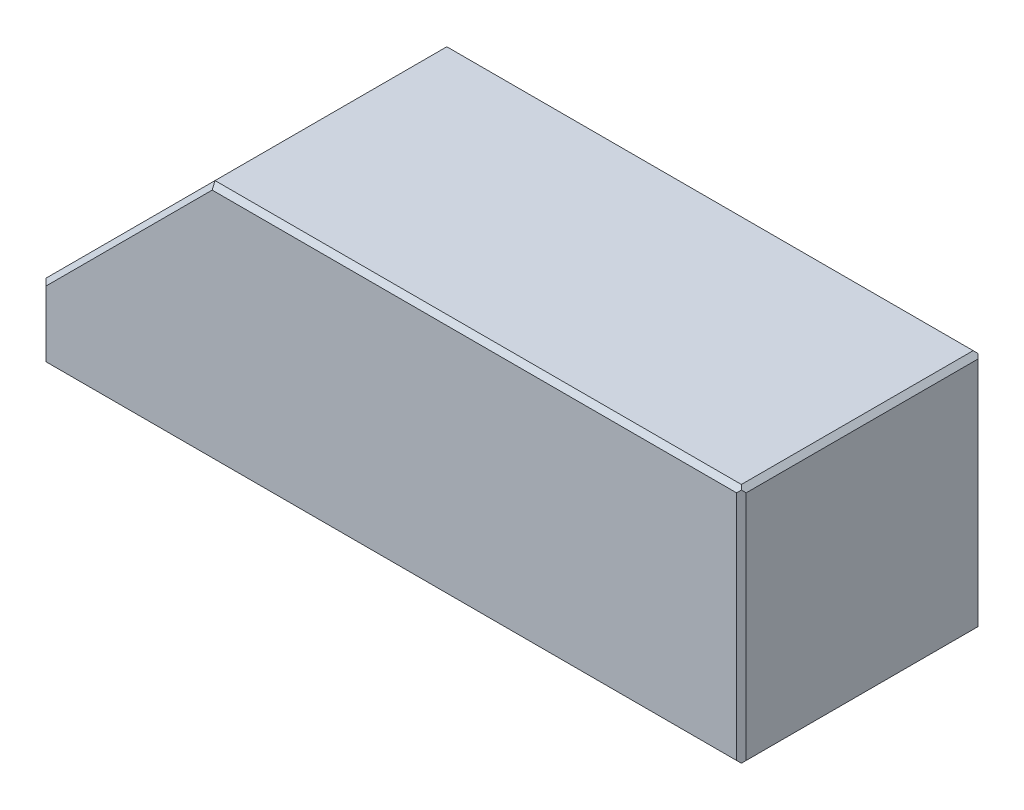
ISO-10303-21;
HEADER;
FILE_DESCRIPTION(('STEP AP214'),'2;1');
FILE_NAME('part.step','',(''),(''),'','','');
FILE_SCHEMA(('AUTOMOTIVE_DESIGN { 1 0 10303 214 1 1 1 1 }'));
ENDSEC;
DATA;
#1=APPLICATION_CONTEXT('core data for automotive mechanical design processes');
#2=APPLICATION_PROTOCOL_DEFINITION('international standard','automotive_design',2000,#1);
#3=PRODUCT_CONTEXT('',#1,'mechanical');
#4=PRODUCT('Part','Part','',(#3));
#5=PRODUCT_RELATED_PRODUCT_CATEGORY('part','',(#4));
#6=PRODUCT_DEFINITION_FORMATION('','',#4);
#7=PRODUCT_DEFINITION_CONTEXT('part definition',#1,'design');
#8=PRODUCT_DEFINITION('design','',#6,#7);
#9=PRODUCT_DEFINITION_SHAPE('','',#8);
#10=(LENGTH_UNIT() NAMED_UNIT(*) SI_UNIT(.MILLI.,.METRE.));
#11=(NAMED_UNIT(*) PLANE_ANGLE_UNIT() SI_UNIT($,.RADIAN.));
#12=(NAMED_UNIT(*) SI_UNIT($,.STERADIAN.) SOLID_ANGLE_UNIT());
#13=UNCERTAINTY_MEASURE_WITH_UNIT(LENGTH_MEASURE(1.E-05),#10,'distance_accuracy_value','');
#14=(GEOMETRIC_REPRESENTATION_CONTEXT(3) GLOBAL_UNCERTAINTY_ASSIGNED_CONTEXT((#13)) GLOBAL_UNIT_ASSIGNED_CONTEXT((#10,
#11,#12)) REPRESENTATION_CONTEXT('',''));
#15=CARTESIAN_POINT('',(0.,0.,0.));
#16=DIRECTION('',(0.,0.,1.));
#17=DIRECTION('',(1.,0.,0.));
#18=AXIS2_PLACEMENT_3D('',#15,#16,#17);
#19=CARTESIAN_POINT('',(-54.5,-5.00000000000001,0.));
#20=DIRECTION('',(1.,0.,0.));
#21=DIRECTION('',(0.,0.,-1.));
#22=AXIS2_PLACEMENT_3D('',#19,#20,#21);
#23=PLANE('',#22);
#24=CARTESIAN_POINT('',(-54.5,-5.,0.));
#25=DIRECTION('',(-1.,0.,0.));
#26=DIRECTION('',(0.,0.,1.));
#27=AXIS2_PLACEMENT_3D('',#24,#25,#26);
#28=CIRCLE('',#27,6.);
#29=CARTESIAN_POINT('',(-54.5,-5.,6.));
#30=VERTEX_POINT('',#29);
#31=EDGE_CURVE('E186',#30,#30,#28,.T.);
#32=ORIENTED_EDGE('',*,*,#31,.T.);
#33=EDGE_LOOP('',(#32));
#34=FACE_BOUND('',#33,.T.);
#35=CARTESIAN_POINT('',(-54.5,-5.,0.));
#36=DIRECTION('',(-1.,0.,0.));
#37=DIRECTION('',(0.,0.,1.));
#38=AXIS2_PLACEMENT_3D('',#35,#36,#37);
#39=CIRCLE('',#38,4.25);
#40=CARTESIAN_POINT('',(-54.5,-5.,4.25));
#41=VERTEX_POINT('',#40);
#42=EDGE_CURVE('E184',#41,#41,#39,.T.);
#43=ORIENTED_EDGE('',*,*,#42,.F.);
#44=EDGE_LOOP('',(#43));
#45=FACE_BOUND('',#44,.T.);
#46=ADVANCED_FACE('F52',(#34,#45),#23,.F.);
#47=CARTESIAN_POINT('',(72.5,-25.,25.));
#48=DIRECTION('',(-1.,0.,0.));
#49=DIRECTION('',(0.,0.,1.));
#50=AXIS2_PLACEMENT_3D('',#47,#48,#49);
#51=PLANE('',#50);
#52=DIRECTION('',(0.,-1.,0.));
#53=VECTOR('',#52,1.);
#54=CARTESIAN_POINT('',(72.5,-25.,24.));
#55=LINE('',#54,#53);
#56=CARTESIAN_POINT('',(72.5,24.,24.));
#57=VERTEX_POINT('',#56);
#58=CARTESIAN_POINT('',(72.5,-24.,24.));
#59=VERTEX_POINT('',#58);
#60=EDGE_CURVE('E223',#57,#59,#55,.T.);
#61=ORIENTED_EDGE('',*,*,#60,.T.);
#62=DIRECTION('',(0.,0.,-1.));
#63=VECTOR('',#62,1.);
#64=CARTESIAN_POINT('',(72.5,-24.,25.));
#65=LINE('',#64,#63);
#66=CARTESIAN_POINT('',(72.5,-24.,-24.));
#67=VERTEX_POINT('',#66);
#68=EDGE_CURVE('E277',#59,#67,#65,.T.);
#69=ORIENTED_EDGE('',*,*,#68,.T.);
#70=DIRECTION('',(0.,1.,0.));
#71=VECTOR('',#70,1.);
#72=CARTESIAN_POINT('',(72.5,25.,-24.));
#73=LINE('',#72,#71);
#74=CARTESIAN_POINT('',(72.5,24.,-24.));
#75=VERTEX_POINT('',#74);
#76=EDGE_CURVE('E226',#67,#75,#73,.T.);
#77=ORIENTED_EDGE('',*,*,#76,.T.);
#78=DIRECTION('',(0.,0.,1.));
#79=VECTOR('',#78,1.);
#80=CARTESIAN_POINT('',(72.5,24.,25.));
#81=LINE('',#80,#79);
#82=EDGE_CURVE('E249',#75,#57,#81,.T.);
#83=ORIENTED_EDGE('',*,*,#82,.T.);
#84=EDGE_LOOP('',(#61,#69,#77,#83));
#85=FACE_BOUND('',#84,.T.);
#86=ADVANCED_FACE('F364',(#85),#51,.F.);
#87=CARTESIAN_POINT('',(-72.5,25.,25.));
#88=DIRECTION('',(0.,-1.,0.));
#89=DIRECTION('',(0.,0.,-1.));
#90=AXIS2_PLACEMENT_3D('',#87,#88,#89);
#91=PLANE('',#90);
#92=DIRECTION('',(1.,0.,0.));
#93=VECTOR('',#92,1.);
#94=CARTESIAN_POINT('',(-72.5,25.,24.));
#95=LINE('',#94,#93);
#96=CARTESIAN_POINT('',(-37.5,25.,24.));
#97=VERTEX_POINT('',#96);
#98=CARTESIAN_POINT('',(71.5,25.,24.));
#99=VERTEX_POINT('',#98);
#100=EDGE_CURVE('E229',#97,#99,#95,.T.);
#101=ORIENTED_EDGE('',*,*,#100,.T.);
#102=DIRECTION('',(0.,0.,-1.));
#103=VECTOR('',#102,1.);
#104=CARTESIAN_POINT('',(71.5,25.,25.));
#105=LINE('',#104,#103);
#106=CARTESIAN_POINT('',(71.5,25.,-24.));
#107=VERTEX_POINT('',#106);
#108=EDGE_CURVE('E295',#99,#107,#105,.T.);
#109=ORIENTED_EDGE('',*,*,#108,.T.);
#110=DIRECTION('',(-1.,0.,0.));
#111=VECTOR('',#110,1.);
#112=CARTESIAN_POINT('',(-37.5,25.,-24.));
#113=LINE('',#112,#111);
#114=CARTESIAN_POINT('',(-37.5,25.,-24.));
#115=VERTEX_POINT('',#114);
#116=EDGE_CURVE('E232',#107,#115,#113,.T.);
#117=ORIENTED_EDGE('',*,*,#116,.T.);
#118=DIRECTION('',(0.,0.,1.));
#119=VECTOR('',#118,1.);
#120=CARTESIAN_POINT('',(-37.5,25.,-25.));
#121=LINE('',#120,#119);
#122=EDGE_CURVE('E195',#115,#97,#121,.T.);
#123=ORIENTED_EDGE('',*,*,#122,.T.);
#124=EDGE_LOOP('',(#101,#109,#117,#123));
#125=FACE_BOUND('',#124,.T.);
#126=ADVANCED_FACE('F371',(#125),#91,.F.);
#127=CARTESIAN_POINT('',(-72.5,-25.,25.));
#128=DIRECTION('',(1.,0.,0.));
#129=DIRECTION('',(0.,0.,-1.));
#130=AXIS2_PLACEMENT_3D('',#127,#128,#129);
#131=PLANE('',#130);
#132=DIRECTION('',(0.,-1.,0.));
#133=VECTOR('',#132,1.);
#134=CARTESIAN_POINT('',(-72.5,-25.,-24.));
#135=LINE('',#134,#133);
#136=CARTESIAN_POINT('',(-72.5,-10.0000000000004,-24.));
#137=VERTEX_POINT('',#136);
#138=CARTESIAN_POINT('',(-72.5,-24.,-24.));
#139=VERTEX_POINT('',#138);
#140=EDGE_CURVE('E205',#137,#139,#135,.T.);
#141=ORIENTED_EDGE('',*,*,#140,.T.);
#142=DIRECTION('',(0.,0.,1.));
#143=VECTOR('',#142,1.);
#144=CARTESIAN_POINT('',(-72.5,-24.,25.));
#145=LINE('',#144,#143);
#146=CARTESIAN_POINT('',(-72.5,-24.,24.));
#147=VERTEX_POINT('',#146);
#148=EDGE_CURVE('E75',#139,#147,#145,.T.);
#149=ORIENTED_EDGE('',*,*,#148,.T.);
#150=DIRECTION('',(0.,1.,0.));
#151=VECTOR('',#150,1.);
#152=CARTESIAN_POINT('',(-72.5,-25.,24.));
#153=LINE('',#152,#151);
#154=CARTESIAN_POINT('',(-72.5,-10.0000000000004,24.));
#155=VERTEX_POINT('',#154);
#156=EDGE_CURVE('E203',#147,#155,#153,.T.);
#157=ORIENTED_EDGE('',*,*,#156,.T.);
#158=DIRECTION('',(0.,0.,1.));
#159=VECTOR('',#158,1.);
#160=CARTESIAN_POINT('',(-72.5,-10.0000000000004,-25.));
#161=LINE('',#160,#159);
#162=CARTESIAN_POINT('',(-72.5,-10.0000000000004,3.31662479035482));
#163=VERTEX_POINT('',#162);
#164=EDGE_CURVE('E194',#163,#155,#161,.T.);
#165=ORIENTED_EDGE('',*,*,#164,.F.);
#166=CARTESIAN_POINT('',(-72.5,-5.,0.));
#167=DIRECTION('',(-1.,0.,0.));
#168=DIRECTION('',(0.,0.,1.));
#169=AXIS2_PLACEMENT_3D('',#166,#167,#168);
#170=CIRCLE('',#169,6.);
#171=CARTESIAN_POINT('',(-72.5,-10.0000000000004,-3.31662479035482));
#172=VERTEX_POINT('',#171);
#173=EDGE_CURVE('E183',#172,#163,#170,.T.);
#174=ORIENTED_EDGE('',*,*,#173,.F.);
#175=EDGE_CURVE('E199',#137,#172,#161,.T.);
#176=ORIENTED_EDGE('',*,*,#175,.F.);
#177=EDGE_LOOP('',(#141,#149,#157,#165,#174,#176));
#178=FACE_BOUND('',#177,.T.);
#179=ADVANCED_FACE('F317',(#178),#131,.F.);
#180=CARTESIAN_POINT('',(-72.5,-25.,25.));
#181=DIRECTION('',(0.,1.,0.));
#182=DIRECTION('',(0.,0.,1.));
#183=AXIS2_PLACEMENT_3D('',#180,#181,#182);
#184=PLANE('',#183);
#185=DIRECTION('',(-1.,0.,0.));
#186=VECTOR('',#185,1.);
#187=CARTESIAN_POINT('',(-72.5,-25.,24.));
#188=LINE('',#187,#186);
#189=CARTESIAN_POINT('',(71.5,-25.,24.));
#190=VERTEX_POINT('',#189);
#191=CARTESIAN_POINT('',(-71.5,-25.,24.));
#192=VERTEX_POINT('',#191);
#193=EDGE_CURVE('E218',#190,#192,#188,.T.);
#194=ORIENTED_EDGE('',*,*,#193,.T.);
#195=DIRECTION('',(0.,0.,-1.));
#196=VECTOR('',#195,1.);
#197=CARTESIAN_POINT('',(-71.5,-25.,25.));
#198=LINE('',#197,#196);
#199=CARTESIAN_POINT('',(-71.5,-25.,-24.));
#200=VERTEX_POINT('',#199);
#201=EDGE_CURVE('E302',#192,#200,#198,.T.);
#202=ORIENTED_EDGE('',*,*,#201,.T.);
#203=DIRECTION('',(1.,0.,0.));
#204=VECTOR('',#203,1.);
#205=CARTESIAN_POINT('',(72.5,-25.,-24.));
#206=LINE('',#205,#204);
#207=CARTESIAN_POINT('',(71.5,-25.,-24.));
#208=VERTEX_POINT('',#207);
#209=EDGE_CURVE('E221',#200,#208,#206,.T.);
#210=ORIENTED_EDGE('',*,*,#209,.T.);
#211=DIRECTION('',(0.,0.,1.));
#212=VECTOR('',#211,1.);
#213=CARTESIAN_POINT('',(71.5,-25.,25.));
#214=LINE('',#213,#212);
#215=EDGE_CURVE('E287',#208,#190,#214,.T.);
#216=ORIENTED_EDGE('',*,*,#215,.T.);
#217=EDGE_LOOP('',(#194,#202,#210,#216));
#218=FACE_BOUND('',#217,.T.);
#219=ADVANCED_FACE('F328',(#218),#184,.F.);
#220=CARTESIAN_POINT('',(0.,0.,25.));
#221=DIRECTION('',(0.,0.,-1.));
#222=DIRECTION('',(-1.,0.,0.));
#223=AXIS2_PLACEMENT_3D('',#220,#221,#222);
#224=PLANE('',#223);
#225=DIRECTION('',(1.,0.,0.));
#226=VECTOR('',#225,1.);
#227=CARTESIAN_POINT('',(0.,-24.,25.));
#228=LINE('',#227,#226);
#229=CARTESIAN_POINT('',(-71.5000000000001,-24.,25.));
#230=VERTEX_POINT('',#229);
#231=CARTESIAN_POINT('',(71.5,-24.,25.));
#232=VERTEX_POINT('',#231);
#233=EDGE_CURVE('E244',#230,#232,#228,.T.);
#234=ORIENTED_EDGE('',*,*,#233,.T.);
#235=DIRECTION('',(0.,1.,0.));
#236=VECTOR('',#235,1.);
#237=CARTESIAN_POINT('',(71.5,0.,25.));
#238=LINE('',#237,#236);
#239=CARTESIAN_POINT('',(71.5,24.,25.));
#240=VERTEX_POINT('',#239);
#241=EDGE_CURVE('E246',#232,#240,#238,.T.);
#242=ORIENTED_EDGE('',*,*,#241,.T.);
#243=DIRECTION('',(-1.,0.,0.));
#244=VECTOR('',#243,1.);
#245=CARTESIAN_POINT('',(0.,24.,25.));
#246=LINE('',#245,#244);
#247=CARTESIAN_POINT('',(-37.085786437627,24.,25.));
#248=VERTEX_POINT('',#247);
#249=EDGE_CURVE('E238',#240,#248,#246,.T.);
#250=ORIENTED_EDGE('',*,*,#249,.T.);
#251=DIRECTION('',(-0.707106781186544,-0.707106781186551,0.));
#252=VECTOR('',#251,1.);
#253=CARTESIAN_POINT('',(-30.5428932188137,30.5428932188134,25.));
#254=LINE('',#253,#252);
#255=CARTESIAN_POINT('',(-71.5000000000001,-10.4142135623735,25.));
#256=VERTEX_POINT('',#255);
#257=EDGE_CURVE('E240',#248,#256,#254,.T.);
#258=ORIENTED_EDGE('',*,*,#257,.T.);
#259=DIRECTION('',(0.,-1.,0.));
#260=VECTOR('',#259,1.);
#261=CARTESIAN_POINT('',(-71.5000000000001,0.,25.));
#262=LINE('',#261,#260);
#263=EDGE_CURVE('E242',#256,#230,#262,.T.);
#264=ORIENTED_EDGE('',*,*,#263,.T.);
#265=EDGE_LOOP('',(#234,#242,#250,#258,#264));
#266=FACE_BOUND('',#265,.T.);
#267=ADVANCED_FACE('F344',(#266),#224,.F.);
#268=CARTESIAN_POINT('',(0.,0.,-25.));
#269=DIRECTION('',(0.,0.,-1.));
#270=DIRECTION('',(-1.,0.,0.));
#271=AXIS2_PLACEMENT_3D('',#268,#269,#270);
#272=PLANE('',#271);
#273=DIRECTION('',(-1.,0.,0.));
#274=VECTOR('',#273,1.);
#275=CARTESIAN_POINT('',(-72.5,-24.,-25.));
#276=LINE('',#275,#274);
#277=CARTESIAN_POINT('',(71.4999999999999,-24.,-25.));
#278=VERTEX_POINT('',#277);
#279=CARTESIAN_POINT('',(-71.5,-24.,-25.));
#280=VERTEX_POINT('',#279);
#281=EDGE_CURVE('E213',#278,#280,#276,.T.);
#282=ORIENTED_EDGE('',*,*,#281,.T.);
#283=DIRECTION('',(0.,1.,0.));
#284=VECTOR('',#283,1.);
#285=CARTESIAN_POINT('',(-71.5,-10.0000000000004,-25.));
#286=LINE('',#285,#284);
#287=CARTESIAN_POINT('',(-71.5,-10.4142135623735,-25.));
#288=VERTEX_POINT('',#287);
#289=EDGE_CURVE('E215',#280,#288,#286,.T.);
#290=ORIENTED_EDGE('',*,*,#289,.T.);
#291=DIRECTION('',(0.707106781186544,0.707106781186551,0.));
#292=VECTOR('',#291,1.);
#293=CARTESIAN_POINT('',(-36.7928932188135,24.2928932188134,-25.));
#294=LINE('',#293,#292);
#295=CARTESIAN_POINT('',(-37.0857864376269,24.,-25.));
#296=VERTEX_POINT('',#295);
#297=EDGE_CURVE('E207',#288,#296,#294,.T.);
#298=ORIENTED_EDGE('',*,*,#297,.T.);
#299=DIRECTION('',(1.,0.,0.));
#300=VECTOR('',#299,1.);
#301=CARTESIAN_POINT('',(72.5,24.,-25.));
#302=LINE('',#301,#300);
#303=CARTESIAN_POINT('',(71.4999999999999,24.,-25.));
#304=VERTEX_POINT('',#303);
#305=EDGE_CURVE('E209',#296,#304,#302,.T.);
#306=ORIENTED_EDGE('',*,*,#305,.T.);
#307=DIRECTION('',(0.,-1.,0.));
#308=VECTOR('',#307,1.);
#309=CARTESIAN_POINT('',(71.4999999999999,-25.,-25.));
#310=LINE('',#309,#308);
#311=EDGE_CURVE('E211',#304,#278,#310,.T.);
#312=ORIENTED_EDGE('',*,*,#311,.T.);
#313=EDGE_LOOP('',(#282,#290,#298,#306,#312));
#314=FACE_BOUND('',#313,.T.);
#315=ADVANCED_FACE('F380',(#314),#272,.T.);
#316=CARTESIAN_POINT('',(-72.5,-10.0000000000004,-25.));
#317=DIRECTION('',(0.707106781186552,-0.707106781186544,0.));
#318=DIRECTION('',(0.707106781186544,0.707106781186551,0.));
#319=AXIS2_PLACEMENT_3D('',#316,#317,#318);
#320=PLANE('',#319);
#321=ORIENTED_EDGE('',*,*,#122,.F.);
#322=DIRECTION('',(-0.707106781186544,-0.707106781186551,0.));
#323=VECTOR('',#322,1.);
#324=CARTESIAN_POINT('',(-72.5,-10.0000000000004,-24.));
#325=LINE('',#324,#323);
#326=EDGE_CURVE('E236',#115,#137,#325,.T.);
#327=ORIENTED_EDGE('',*,*,#326,.T.);
#328=ORIENTED_EDGE('',*,*,#175,.T.);
#329=CARTESIAN_POINT('',(-67.4999999999997,-5.,0.));
#330=DIRECTION('',(0.707106781186552,-0.707106781186544,0.));
#331=DIRECTION('',(-0.707106781186544,-0.707106781186551,0.));
#332=AXIS2_PLACEMENT_3D('',#329,#330,#331);
#333=ELLIPSE('',#332,8.48528137423852,6.);
#334=EDGE_CURVE('E198',#172,#163,#333,.T.);
#335=ORIENTED_EDGE('',*,*,#334,.T.);
#336=ORIENTED_EDGE('',*,*,#164,.T.);
#337=DIRECTION('',(0.707106781186544,0.707106781186551,0.));
#338=VECTOR('',#337,1.);
#339=CARTESIAN_POINT('',(-72.5,-10.0000000000004,24.));
#340=LINE('',#339,#338);
#341=EDGE_CURVE('E234',#155,#97,#340,.T.);
#342=ORIENTED_EDGE('',*,*,#341,.T.);
#343=EDGE_LOOP('',(#321,#327,#328,#335,#336,#342));
#344=FACE_BOUND('',#343,.T.);
#345=ADVANCED_FACE('F377',(#344),#320,.F.);
#346=CARTESIAN_POINT('',(-72.5,-5.,0.));
#347=DIRECTION('',(-1.,0.,0.));
#348=DIRECTION('',(0.,0.,1.));
#349=AXIS2_PLACEMENT_3D('',#346,#347,#348);
#350=CYLINDRICAL_SURFACE('',#349,6.);
#351=ORIENTED_EDGE('',*,*,#31,.F.);
#352=EDGE_LOOP('',(#351));
#353=FACE_BOUND('',#352,.T.);
#354=ORIENTED_EDGE('',*,*,#173,.T.);
#355=ORIENTED_EDGE('',*,*,#334,.F.);
#356=EDGE_LOOP('',(#354,#355));
#357=FACE_BOUND('',#356,.T.);
#358=ADVANCED_FACE('F177',(#353,#357),#350,.F.);
#359=CARTESIAN_POINT('',(-29.5536576308671,-5.,0.));
#360=DIRECTION('',(-1.,0.,0.));
#361=DIRECTION('',(0.,0.,1.));
#362=AXIS2_PLACEMENT_3D('',#359,#360,#361);
#363=CONICAL_SURFACE('',#362,4.25,1.02974425867665);
#364=CARTESIAN_POINT('',(-27.,-5.00000000000001,0.));
#365=VERTEX_POINT('',#364);
#366=VERTEX_LOOP('',#365);
#367=FACE_BOUND('',#366,.T.);
#368=CARTESIAN_POINT('',(-29.5536576308671,-5.,0.));
#369=DIRECTION('',(-1.,0.,0.));
#370=DIRECTION('',(0.,0.,1.));
#371=AXIS2_PLACEMENT_3D('',#368,#369,#370);
#372=CIRCLE('',#371,4.25);
#373=CARTESIAN_POINT('',(-29.5536576308671,-5.,4.25));
#374=VERTEX_POINT('',#373);
#375=EDGE_CURVE('E181',#374,#374,#372,.T.);
#376=ORIENTED_EDGE('',*,*,#375,.T.);
#377=EDGE_LOOP('',(#376));
#378=FACE_BOUND('',#377,.T.);
#379=ADVANCED_FACE('F173',(#367,#378),#363,.F.);
#380=CARTESIAN_POINT('',(-54.5,-5.,0.));
#381=DIRECTION('',(-1.,0.,0.));
#382=DIRECTION('',(0.,0.,1.));
#383=AXIS2_PLACEMENT_3D('',#380,#381,#382);
#384=CYLINDRICAL_SURFACE('',#383,4.25);
#385=ORIENTED_EDGE('',*,*,#375,.F.);
#386=EDGE_LOOP('',(#385));
#387=FACE_BOUND('',#386,.T.);
#388=ORIENTED_EDGE('',*,*,#42,.T.);
#389=EDGE_LOOP('',(#388));
#390=FACE_BOUND('',#389,.T.);
#391=ADVANCED_FACE('F176',(#387,#390),#384,.F.);
#392=CARTESIAN_POINT('',(-72.5,25.,-24.));
#393=DIRECTION('',(0.,0.707106781186543,-0.707106781186552));
#394=DIRECTION('',(1.,0.,0.));
#395=AXIS2_PLACEMENT_3D('',#392,#393,#394);
#396=PLANE('',#395);
#397=ORIENTED_EDGE('',*,*,#116,.F.);
#398=DIRECTION('',(-0.577350269189634,0.577350269189626,0.577350269189618));
#399=VECTOR('',#398,1.);
#400=CARTESIAN_POINT('',(23.4999999999986,73.0000000000007,24.));
#401=LINE('',#400,#399);
#402=CARTESIAN_POINT('',(72.,24.5,-24.5));
#403=VERTEX_POINT('',#402);
#404=EDGE_CURVE('E298',#107,#403,#401,.F.);
#405=ORIENTED_EDGE('',*,*,#404,.T.);
#406=DIRECTION('',(-0.577350269189628,-0.577350269189628,-0.57735026918962));
#407=VECTOR('',#406,1.);
#408=CARTESIAN_POINT('',(24.1666666666662,-23.3333333333338,-72.3333333333331));
#409=LINE('',#408,#407);
#410=EDGE_CURVE('E189',#304,#403,#409,.F.);
#411=ORIENTED_EDGE('',*,*,#410,.F.);
#412=ORIENTED_EDGE('',*,*,#305,.F.);
#413=DIRECTION('',(0.281084637714824,-0.678598344545851,-0.678598344545842));
#414=VECTOR('',#413,1.);
#415=CARTESIAN_POINT('',(-37.8168565870344,25.7649594697456,-23.2350405302544));
#416=LINE('',#415,#414);
#417=EDGE_CURVE('E259',#115,#296,#416,.T.);
#418=ORIENTED_EDGE('',*,*,#417,.F.);
#419=EDGE_LOOP('',(#397,#405,#411,#412,#418));
#420=FACE_BOUND('',#419,.T.);
#421=ADVANCED_FACE('F417',(#420),#396,.T.);
#422=CARTESIAN_POINT('',(72.5,-25.,-24.));
#423=DIRECTION('',(0.707106781186543,0.,-0.707106781186552));
#424=DIRECTION('',(0.,-1.,0.));
#425=AXIS2_PLACEMENT_3D('',#422,#423,#424);
#426=PLANE('',#425);
#427=ORIENTED_EDGE('',*,*,#76,.F.);
#428=DIRECTION('',(0.577350269189629,0.577350269189629,0.577350269189621));
#429=VECTOR('',#428,1.);
#430=CARTESIAN_POINT('',(72.1666666666666,-24.3333333333334,-24.3333333333333));
#431=LINE('',#430,#429);
#432=CARTESIAN_POINT('',(72.,-24.5,-24.5));
#433=VERTEX_POINT('',#432);
#434=EDGE_CURVE('E282',#67,#433,#431,.F.);
#435=ORIENTED_EDGE('',*,*,#434,.T.);
#436=DIRECTION('',(-0.577350269189628,0.577350269189628,-0.57735026918962));
#437=VECTOR('',#436,1.);
#438=CARTESIAN_POINT('',(72.5,-25.,-24.));
#439=LINE('',#438,#437);
#440=EDGE_CURVE('E256',#278,#433,#439,.F.);
#441=ORIENTED_EDGE('',*,*,#440,.F.);
#442=ORIENTED_EDGE('',*,*,#311,.F.);
#443=ORIENTED_EDGE('',*,*,#410,.T.);
#444=DIRECTION('',(-0.577350269189631,0.577350269189623,-0.577350269189623));
#445=VECTOR('',#444,1.);
#446=CARTESIAN_POINT('',(88.8333333333334,7.66666666666683,-7.6666666666668));
#447=LINE('',#446,#445);
#448=EDGE_CURVE('E280',#403,#75,#447,.F.);
#449=ORIENTED_EDGE('',*,*,#448,.T.);
#450=EDGE_LOOP('',(#427,#435,#441,#442,#443,#449));
#451=FACE_BOUND('',#450,.T.);
#452=ADVANCED_FACE('F410',(#451),#426,.T.);
#453=CARTESIAN_POINT('',(-30.5428932188137,30.5428932188133,-25.));
#454=DIRECTION('',(-0.499999999999999,0.499999999999994,-0.707106781186552));
#455=DIRECTION('',(-0.707106781186544,-0.707106781186551,0.));
#456=AXIS2_PLACEMENT_3D('',#453,#454,#455);
#457=PLANE('',#456);
#458=ORIENTED_EDGE('',*,*,#417,.T.);
#459=ORIENTED_EDGE('',*,*,#297,.F.);
#460=DIRECTION('',(-0.678598344545852,0.28108463771482,0.678598344545842));
#461=VECTOR('',#460,1.);
#462=CARTESIAN_POINT('',(-60.4517326587292,-14.9905557358516,-36.0482673412706));
#463=LINE('',#462,#461);
#464=EDGE_CURVE('E253',#137,#288,#463,.F.);
#465=ORIENTED_EDGE('',*,*,#464,.F.);
#466=ORIENTED_EDGE('',*,*,#326,.F.);
#467=EDGE_LOOP('',(#458,#459,#465,#466));
#468=FACE_BOUND('',#467,.T.);
#469=ADVANCED_FACE('F403',(#468),#457,.T.);
#470=CARTESIAN_POINT('',(-72.5,-25.,-24.));
#471=DIRECTION('',(0.,-0.707106781186543,-0.707106781186552));
#472=DIRECTION('',(-1.,0.,0.));
#473=AXIS2_PLACEMENT_3D('',#470,#471,#472);
#474=PLANE('',#473);
#475=ORIENTED_EDGE('',*,*,#209,.F.);
#476=DIRECTION('',(0.577350269189634,-0.577350269189626,0.577350269189618));
#477=VECTOR('',#476,1.);
#478=CARTESIAN_POINT('',(-71.8333333333334,-24.6666666666667,-24.3333333333333));
#479=LINE('',#478,#477);
#480=CARTESIAN_POINT('',(-72.,-24.5,-24.5));
#481=VERTEX_POINT('',#480);
#482=EDGE_CURVE('E305',#200,#481,#479,.F.);
#483=ORIENTED_EDGE('',*,*,#482,.T.);
#484=DIRECTION('',(0.577350269189628,0.577350269189628,-0.57735026918962));
#485=VECTOR('',#484,1.);
#486=CARTESIAN_POINT('',(-72.5,-25.,-24.));
#487=LINE('',#486,#485);
#488=EDGE_CURVE('E250',#280,#481,#487,.F.);
#489=ORIENTED_EDGE('',*,*,#488,.F.);
#490=ORIENTED_EDGE('',*,*,#281,.F.);
#491=ORIENTED_EDGE('',*,*,#440,.T.);
#492=DIRECTION('',(0.577350269189629,0.577350269189629,-0.577350269189621));
#493=VECTOR('',#492,1.);
#494=CARTESIAN_POINT('',(23.4999999999995,-73.0000000000005,23.9999999999998));
#495=LINE('',#494,#493);
#496=EDGE_CURVE('E284',#433,#208,#495,.F.);
#497=ORIENTED_EDGE('',*,*,#496,.T.);
#498=EDGE_LOOP('',(#475,#483,#489,#490,#491,#497));
#499=FACE_BOUND('',#498,.T.);
#500=ADVANCED_FACE('F359',(#499),#474,.T.);
#501=CARTESIAN_POINT('',(-72.5,-25.,-24.));
#502=DIRECTION('',(-0.707106781186543,0.,-0.707106781186552));
#503=DIRECTION('',(0.,1.,0.));
#504=AXIS2_PLACEMENT_3D('',#501,#502,#503);
#505=PLANE('',#504);
#506=ORIENTED_EDGE('',*,*,#488,.T.);
#507=DIRECTION('',(0.577350269189631,-0.577350269189623,-0.577350269189623));
#508=VECTOR('',#507,1.);
#509=CARTESIAN_POINT('',(-72.1666666666667,-24.3333333333333,-24.3333333333333));
#510=LINE('',#509,#508);
#511=EDGE_CURVE('E307',#481,#139,#510,.F.);
#512=ORIENTED_EDGE('',*,*,#511,.T.);
#513=ORIENTED_EDGE('',*,*,#140,.F.);
#514=ORIENTED_EDGE('',*,*,#464,.T.);
#515=ORIENTED_EDGE('',*,*,#289,.F.);
#516=EDGE_LOOP('',(#506,#512,#513,#514,#515));
#517=FACE_BOUND('',#516,.T.);
#518=ADVANCED_FACE('F312',(#517),#505,.T.);
#519=CARTESIAN_POINT('',(-71.5000000000001,0.,25.));
#520=DIRECTION('',(0.707106781186548,0.,-0.707106781186548));
#521=DIRECTION('',(0.,-1.,0.));
#522=AXIS2_PLACEMENT_3D('',#519,#520,#521);
#523=PLANE('',#522);
#524=ORIENTED_EDGE('',*,*,#156,.F.);
#525=DIRECTION('',(0.577350269189629,-0.577350269189621,0.577350269189629));
#526=VECTOR('',#525,1.);
#527=CARTESIAN_POINT('',(-79.8333333333333,-16.6666666666668,16.6666666666667));
#528=LINE('',#527,#526);
#529=CARTESIAN_POINT('',(-72.,-24.5,24.5));
#530=VERTEX_POINT('',#529);
#531=EDGE_CURVE('E61',#147,#530,#528,.T.);
#532=ORIENTED_EDGE('',*,*,#531,.T.);
#533=DIRECTION('',(0.577350269189626,0.577350269189626,0.577350269189626));
#534=VECTOR('',#533,1.);
#535=CARTESIAN_POINT('',(-63.5000000000001,-16.,33.));
#536=LINE('',#535,#534);
#537=EDGE_CURVE('E272',#230,#530,#536,.F.);
#538=ORIENTED_EDGE('',*,*,#537,.F.);
#539=ORIENTED_EDGE('',*,*,#263,.F.);
#540=DIRECTION('',(0.678598344545848,-0.281084637714815,0.678598344545848));
#541=VECTOR('',#540,1.);
#542=CARTESIAN_POINT('',(-72.5,-10.0000000000004,24.));
#543=LINE('',#542,#541);
#544=EDGE_CURVE('E254',#155,#256,#543,.T.);
#545=ORIENTED_EDGE('',*,*,#544,.F.);
#546=EDGE_LOOP('',(#524,#532,#538,#539,#545));
#547=FACE_BOUND('',#546,.T.);
#548=ADVANCED_FACE('F348',(#547),#523,.F.);
#549=CARTESIAN_POINT('',(-72.5,-10.0000000000004,24.));
#550=DIRECTION('',(0.500000000000004,-0.499999999999998,-0.707106781186546));
#551=DIRECTION('',(0.707106781186544,0.707106781186551,0.));
#552=AXIS2_PLACEMENT_3D('',#549,#550,#551);
#553=PLANE('',#552);
#554=ORIENTED_EDGE('',*,*,#544,.T.);
#555=ORIENTED_EDGE('',*,*,#257,.F.);
#556=DIRECTION('',(0.281084637714819,-0.678598344545847,0.678598344545847));
#557=VECTOR('',#556,1.);
#558=CARTESIAN_POINT('',(-34.1556913518663,16.9261247049138,32.0738752950862));
#559=LINE('',#558,#557);
#560=EDGE_CURVE('E269',#97,#248,#559,.T.);
#561=ORIENTED_EDGE('',*,*,#560,.F.);
#562=ORIENTED_EDGE('',*,*,#341,.F.);
#563=EDGE_LOOP('',(#554,#555,#561,#562));
#564=FACE_BOUND('',#563,.T.);
#565=ADVANCED_FACE('F350',(#564),#553,.F.);
#566=CARTESIAN_POINT('',(0.,-24.,25.));
#567=DIRECTION('',(0.,0.707106781186548,-0.707106781186548));
#568=DIRECTION('',(1.,0.,0.));
#569=AXIS2_PLACEMENT_3D('',#566,#567,#568);
#570=PLANE('',#569);
#571=ORIENTED_EDGE('',*,*,#537,.T.);
#572=DIRECTION('',(0.577350269189631,-0.577350269189623,-0.577350269189623));
#573=VECTOR('',#572,1.);
#574=CARTESIAN_POINT('',(-48.3333333333329,-48.1666666666668,0.833333333333224));
#575=LINE('',#574,#573);
#576=EDGE_CURVE('E11',#530,#192,#575,.T.);
#577=ORIENTED_EDGE('',*,*,#576,.T.);
#578=ORIENTED_EDGE('',*,*,#193,.F.);
#579=DIRECTION('',(0.577350269189626,0.577350269189626,0.577350269189626));
#580=VECTOR('',#579,1.);
#581=CARTESIAN_POINT('',(48.3333333333333,-48.1666666666667,0.833333333333353));
#582=LINE('',#581,#580);
#583=CARTESIAN_POINT('',(72.,-24.5,24.5));
#584=VERTEX_POINT('',#583);
#585=EDGE_CURVE('E289',#190,#584,#582,.T.);
#586=ORIENTED_EDGE('',*,*,#585,.T.);
#587=DIRECTION('',(-0.577350269189626,0.577350269189626,0.577350269189626));
#588=VECTOR('',#587,1.);
#589=CARTESIAN_POINT('',(47.6666666666667,-0.166666666666711,48.8333333333333));
#590=LINE('',#589,#588);
#591=EDGE_CURVE('E266',#232,#584,#590,.F.);
#592=ORIENTED_EDGE('',*,*,#591,.F.);
#593=ORIENTED_EDGE('',*,*,#233,.F.);
#594=EDGE_LOOP('',(#571,#577,#578,#586,#592,#593));
#595=FACE_BOUND('',#594,.T.);
#596=ADVANCED_FACE('F324',(#595),#570,.F.);
#597=CARTESIAN_POINT('',(0.,24.,25.));
#598=DIRECTION('',(0.,-0.707106781186548,-0.707106781186548));
#599=DIRECTION('',(-1.,0.,0.));
#600=AXIS2_PLACEMENT_3D('',#597,#598,#599);
#601=PLANE('',#600);
#602=DIRECTION('',(0.577350269189626,0.577350269189626,-0.577350269189626));
#603=VECTOR('',#602,1.);
#604=CARTESIAN_POINT('',(47.6666666666667,0.166666666666711,48.8333333333333));
#605=LINE('',#604,#603);
#606=CARTESIAN_POINT('',(72.,24.5,24.5));
#607=VERTEX_POINT('',#606);
#608=EDGE_CURVE('E264',#607,#240,#605,.F.);
#609=ORIENTED_EDGE('',*,*,#608,.F.);
#610=DIRECTION('',(-0.577350269189631,0.577350269189623,-0.577350269189623));
#611=VECTOR('',#610,1.);
#612=CARTESIAN_POINT('',(48.3333333333328,48.1666666666668,0.833333333333245));
#613=LINE('',#612,#611);
#614=EDGE_CURVE('E300',#607,#99,#613,.T.);
#615=ORIENTED_EDGE('',*,*,#614,.T.);
#616=ORIENTED_EDGE('',*,*,#100,.F.);
#617=ORIENTED_EDGE('',*,*,#560,.T.);
#618=ORIENTED_EDGE('',*,*,#249,.F.);
#619=EDGE_LOOP('',(#609,#615,#616,#617,#618));
#620=FACE_BOUND('',#619,.T.);
#621=ADVANCED_FACE('F431',(#620),#601,.F.);
#622=CARTESIAN_POINT('',(71.5,0.,25.));
#623=DIRECTION('',(-0.707106781186548,0.,-0.707106781186548));
#624=DIRECTION('',(0.,1.,0.));
#625=AXIS2_PLACEMENT_3D('',#622,#623,#624);
#626=PLANE('',#625);
#627=ORIENTED_EDGE('',*,*,#591,.T.);
#628=DIRECTION('',(0.577350269189626,0.577350269189626,-0.577350269189626));
#629=VECTOR('',#628,1.);
#630=CARTESIAN_POINT('',(79.8333333333333,-16.6666666666667,16.6666666666667));
#631=LINE('',#630,#629);
#632=EDGE_CURVE('E293',#584,#59,#631,.T.);
#633=ORIENTED_EDGE('',*,*,#632,.T.);
#634=ORIENTED_EDGE('',*,*,#60,.F.);
#635=DIRECTION('',(-0.577350269189629,0.577350269189621,0.577350269189629));
#636=VECTOR('',#635,1.);
#637=CARTESIAN_POINT('',(79.8333333333333,16.6666666666668,16.6666666666667));
#638=LINE('',#637,#636);
#639=EDGE_CURVE('E291',#57,#607,#638,.T.);
#640=ORIENTED_EDGE('',*,*,#639,.T.);
#641=ORIENTED_EDGE('',*,*,#608,.T.);
#642=ORIENTED_EDGE('',*,*,#241,.F.);
#643=EDGE_LOOP('',(#627,#633,#634,#640,#641,#642));
#644=FACE_BOUND('',#643,.T.);
#645=ADVANCED_FACE('F339',(#644),#626,.F.);
#646=CARTESIAN_POINT('',(72.5,-24.,25.));
#647=DIRECTION('',(-0.707106781186548,0.707106781186548,0.));
#648=DIRECTION('',(0.,0.,-1.));
#649=AXIS2_PLACEMENT_3D('',#646,#647,#648);
#650=PLANE('',#649);
#651=ORIENTED_EDGE('',*,*,#585,.F.);
#652=ORIENTED_EDGE('',*,*,#215,.F.);
#653=ORIENTED_EDGE('',*,*,#496,.F.);
#654=ORIENTED_EDGE('',*,*,#434,.F.);
#655=ORIENTED_EDGE('',*,*,#68,.F.);
#656=ORIENTED_EDGE('',*,*,#632,.F.);
#657=EDGE_LOOP('',(#651,#652,#653,#654,#655,#656));
#658=FACE_BOUND('',#657,.T.);
#659=ADVANCED_FACE('F333',(#658),#650,.F.);
#660=CARTESIAN_POINT('',(71.5,25.,25.));
#661=DIRECTION('',(-0.707106781186543,-0.707106781186552,0.));
#662=DIRECTION('',(0.,0.,-1.));
#663=AXIS2_PLACEMENT_3D('',#660,#661,#662);
#664=PLANE('',#663);
#665=ORIENTED_EDGE('',*,*,#639,.F.);
#666=ORIENTED_EDGE('',*,*,#82,.F.);
#667=ORIENTED_EDGE('',*,*,#448,.F.);
#668=ORIENTED_EDGE('',*,*,#404,.F.);
#669=ORIENTED_EDGE('',*,*,#108,.F.);
#670=ORIENTED_EDGE('',*,*,#614,.F.);
#671=EDGE_LOOP('',(#665,#666,#667,#668,#669,#670));
#672=FACE_BOUND('',#671,.T.);
#673=ADVANCED_FACE('F455',(#672),#664,.F.);
#674=CARTESIAN_POINT('',(-71.5,-25.,25.));
#675=DIRECTION('',(0.707106781186543,0.707106781186552,0.));
#676=DIRECTION('',(0.,0.,-1.));
#677=AXIS2_PLACEMENT_3D('',#674,#675,#676);
#678=PLANE('',#677);
#679=ORIENTED_EDGE('',*,*,#531,.F.);
#680=ORIENTED_EDGE('',*,*,#148,.F.);
#681=ORIENTED_EDGE('',*,*,#511,.F.);
#682=ORIENTED_EDGE('',*,*,#482,.F.);
#683=ORIENTED_EDGE('',*,*,#201,.F.);
#684=ORIENTED_EDGE('',*,*,#576,.F.);
#685=EDGE_LOOP('',(#679,#680,#681,#682,#683,#684));
#686=FACE_BOUND('',#685,.T.);
#687=ADVANCED_FACE('F55',(#686),#678,.F.);
#688=CLOSED_SHELL('',(#46,#86,#126,#179,#219,#267,#315,#345,#358,#379,#391,#421,#452,#469,#500,
#518,#548,#565,#596,#621,#645,#659,#673,#687));
#689=MANIFOLD_SOLID_BREP('B2',#688);
#690=ADVANCED_BREP_SHAPE_REPRESENTATION('',(#18,#689),#14);
#691=SHAPE_DEFINITION_REPRESENTATION(#9,#690);
ENDSEC;
END-ISO-10303-21;
